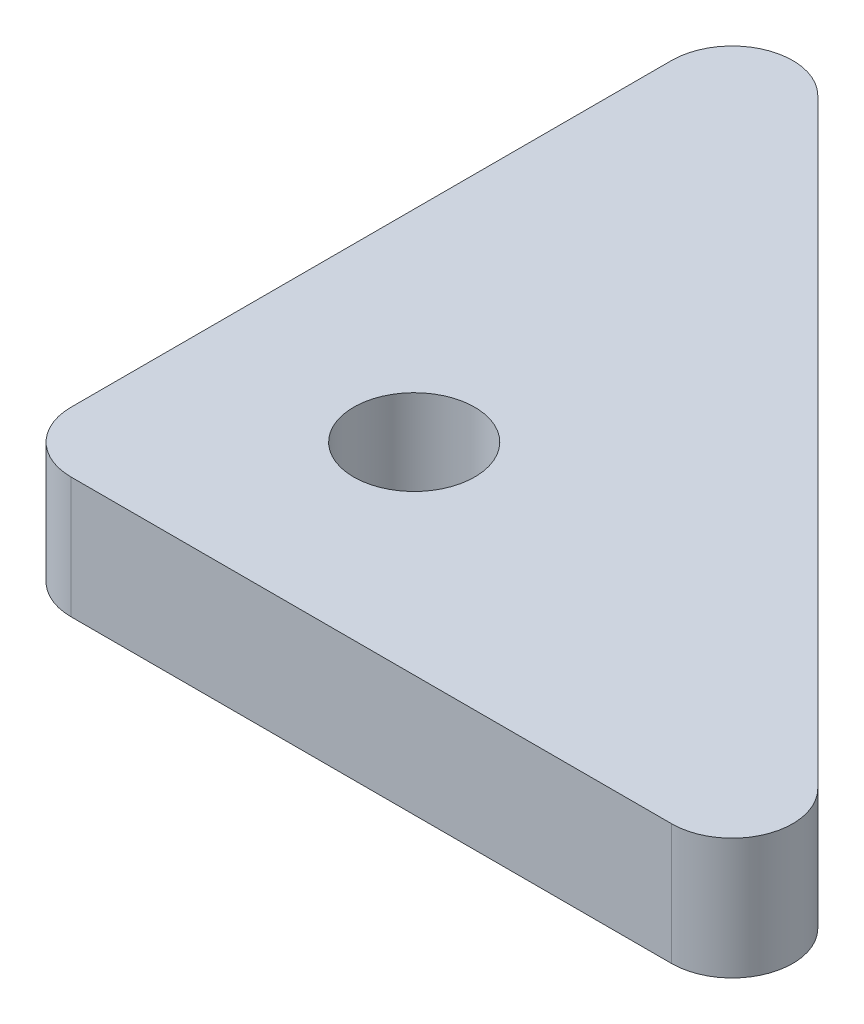
ISO-10303-21;
HEADER;
FILE_DESCRIPTION(('STEP AP214'),'2;1');
FILE_NAME('part.step','',(''),(''),'','','');
FILE_SCHEMA(('AUTOMOTIVE_DESIGN { 1 0 10303 214 1 1 1 1 }'));
ENDSEC;
DATA;
#1=APPLICATION_CONTEXT('core data for automotive mechanical design processes');
#2=APPLICATION_PROTOCOL_DEFINITION('international standard','automotive_design',2000,#1);
#3=PRODUCT_CONTEXT('',#1,'mechanical');
#4=PRODUCT('Part','Part','',(#3));
#5=PRODUCT_RELATED_PRODUCT_CATEGORY('part','',(#4));
#6=PRODUCT_DEFINITION_FORMATION('','',#4);
#7=PRODUCT_DEFINITION_CONTEXT('part definition',#1,'design');
#8=PRODUCT_DEFINITION('design','',#6,#7);
#9=PRODUCT_DEFINITION_SHAPE('','',#8);
#10=(LENGTH_UNIT() NAMED_UNIT(*) SI_UNIT(.MILLI.,.METRE.));
#11=(NAMED_UNIT(*) PLANE_ANGLE_UNIT() SI_UNIT($,.RADIAN.));
#12=(NAMED_UNIT(*) SI_UNIT($,.STERADIAN.) SOLID_ANGLE_UNIT());
#13=UNCERTAINTY_MEASURE_WITH_UNIT(LENGTH_MEASURE(1.E-05),#10,'distance_accuracy_value','');
#14=(GEOMETRIC_REPRESENTATION_CONTEXT(3) GLOBAL_UNCERTAINTY_ASSIGNED_CONTEXT((#13)) GLOBAL_UNIT_ASSIGNED_CONTEXT((#10,
#11,#12)) REPRESENTATION_CONTEXT('',''));
#15=CARTESIAN_POINT('',(0.,0.,0.));
#16=DIRECTION('',(0.,0.,1.));
#17=DIRECTION('',(1.,0.,0.));
#18=AXIS2_PLACEMENT_3D('',#15,#16,#17);
#19=CARTESIAN_POINT('',(3.,6.,-3.));
#20=DIRECTION('',(0.,-1.,0.));
#21=DIRECTION('',(0.,0.,-1.));
#22=AXIS2_PLACEMENT_3D('',#19,#20,#21);
#23=PLANE('',#22);
#24=CARTESIAN_POINT('',(3.,6.,-3.));
#25=DIRECTION('',(0.,1.,0.));
#26=DIRECTION('',(0.,0.,-1.));
#27=AXIS2_PLACEMENT_3D('',#24,#25,#26);
#28=CIRCLE('',#27,3.);
#29=CARTESIAN_POINT('',(0.,6.,-3.00000000000002));
#30=VERTEX_POINT('',#29);
#31=CARTESIAN_POINT('',(3.00000000000002,6.,0.));
#32=VERTEX_POINT('',#31);
#33=EDGE_CURVE('E131',#30,#32,#28,.T.);
#34=ORIENTED_EDGE('',*,*,#33,.T.);
#35=DIRECTION('',(1.,0.,0.));
#36=VECTOR('',#35,1.);
#37=CARTESIAN_POINT('',(3.00000000000002,6.,0.));
#38=LINE('',#37,#36);
#39=CARTESIAN_POINT('',(32.7573593128806,6.,0.));
#40=VERTEX_POINT('',#39);
#41=EDGE_CURVE('E89',#32,#40,#38,.T.);
#42=ORIENTED_EDGE('',*,*,#41,.T.);
#43=CARTESIAN_POINT('',(32.7573593128807,6.,-3.));
#44=DIRECTION('',(0.,1.,0.));
#45=DIRECTION('',(0.,0.,1.));
#46=AXIS2_PLACEMENT_3D('',#43,#44,#45);
#47=CIRCLE('',#46,3.);
#48=CARTESIAN_POINT('',(34.8786796564403,6.,-5.1213203435597));
#49=VERTEX_POINT('',#48);
#50=EDGE_CURVE('E102',#40,#49,#47,.T.);
#51=ORIENTED_EDGE('',*,*,#50,.T.);
#52=DIRECTION('',(-0.707106781186547,0.,-0.707106781186547));
#53=VECTOR('',#52,1.);
#54=CARTESIAN_POINT('',(5.12132034355969,6.,-34.8786796564403));
#55=LINE('',#54,#53);
#56=CARTESIAN_POINT('',(5.12132034355969,6.,-34.8786796564403));
#57=VERTEX_POINT('',#56);
#58=EDGE_CURVE('E96',#49,#57,#55,.T.);
#59=ORIENTED_EDGE('',*,*,#58,.T.);
#60=CARTESIAN_POINT('',(3.,6.,-32.7573593128807));
#61=DIRECTION('',(0.,1.,0.));
#62=DIRECTION('',(0.,0.,-1.));
#63=AXIS2_PLACEMENT_3D('',#60,#61,#62);
#64=CIRCLE('',#63,3.);
#65=CARTESIAN_POINT('',(0.,6.,-32.7573593128806));
#66=VERTEX_POINT('',#65);
#67=EDGE_CURVE('E100',#57,#66,#64,.T.);
#68=ORIENTED_EDGE('',*,*,#67,.T.);
#69=DIRECTION('',(0.,0.,1.));
#70=VECTOR('',#69,1.);
#71=CARTESIAN_POINT('',(0.,6.,-3.00000000000002));
#72=LINE('',#71,#70);
#73=EDGE_CURVE('E52',#66,#30,#72,.T.);
#74=ORIENTED_EDGE('',*,*,#73,.T.);
#75=EDGE_LOOP('',(#34,#42,#51,#59,#68,#74));
#76=FACE_BOUND('',#75,.T.);
#77=CARTESIAN_POINT('',(10.,6.,-10.));
#78=DIRECTION('',(0.,1.,0.));
#79=DIRECTION('',(0.,0.,1.));
#80=AXIS2_PLACEMENT_3D('',#77,#78,#79);
#81=CIRCLE('',#80,3.);
#82=CARTESIAN_POINT('',(10.,6.,-7.));
#83=VERTEX_POINT('',#82);
#84=EDGE_CURVE('E124',#83,#83,#81,.T.);
#85=ORIENTED_EDGE('',*,*,#84,.F.);
#86=EDGE_LOOP('',(#85));
#87=FACE_BOUND('',#86,.T.);
#88=ADVANCED_FACE('F35',(#76,#87),#23,.F.);
#89=CARTESIAN_POINT('',(3.,0.,-3.));
#90=DIRECTION('',(0.,-1.,0.));
#91=DIRECTION('',(0.,0.,-1.));
#92=AXIS2_PLACEMENT_3D('',#89,#90,#91);
#93=PLANE('',#92);
#94=CARTESIAN_POINT('',(3.,0.,-3.));
#95=DIRECTION('',(0.,1.,0.));
#96=DIRECTION('',(0.,0.,-1.));
#97=AXIS2_PLACEMENT_3D('',#94,#95,#96);
#98=CIRCLE('',#97,3.);
#99=CARTESIAN_POINT('',(0.,0.,-3.00000000000002));
#100=VERTEX_POINT('',#99);
#101=CARTESIAN_POINT('',(3.00000000000002,0.,0.));
#102=VERTEX_POINT('',#101);
#103=EDGE_CURVE('E120',#100,#102,#98,.T.);
#104=ORIENTED_EDGE('',*,*,#103,.F.);
#105=DIRECTION('',(0.,0.,1.));
#106=VECTOR('',#105,1.);
#107=CARTESIAN_POINT('',(0.,0.,-3.00000000000002));
#108=LINE('',#107,#106);
#109=CARTESIAN_POINT('',(0.,0.,-32.7573593128806));
#110=VERTEX_POINT('',#109);
#111=EDGE_CURVE('E81',#110,#100,#108,.T.);
#112=ORIENTED_EDGE('',*,*,#111,.F.);
#113=CARTESIAN_POINT('',(3.,0.,-32.7573593128807));
#114=DIRECTION('',(0.,1.,0.));
#115=DIRECTION('',(0.,0.,-1.));
#116=AXIS2_PLACEMENT_3D('',#113,#114,#115);
#117=CIRCLE('',#116,3.);
#118=CARTESIAN_POINT('',(5.12132034355969,0.,-34.8786796564403));
#119=VERTEX_POINT('',#118);
#120=EDGE_CURVE('E75',#119,#110,#117,.T.);
#121=ORIENTED_EDGE('',*,*,#120,.F.);
#122=DIRECTION('',(-0.707106781186547,0.,-0.707106781186547));
#123=VECTOR('',#122,1.);
#124=CARTESIAN_POINT('',(5.12132034355969,0.,-34.8786796564403));
#125=LINE('',#124,#123);
#126=CARTESIAN_POINT('',(34.8786796564403,0.,-5.1213203435597));
#127=VERTEX_POINT('',#126);
#128=EDGE_CURVE('E110',#127,#119,#125,.T.);
#129=ORIENTED_EDGE('',*,*,#128,.F.);
#130=CARTESIAN_POINT('',(32.7573593128807,0.,-3.));
#131=DIRECTION('',(0.,1.,0.));
#132=DIRECTION('',(0.,0.,1.));
#133=AXIS2_PLACEMENT_3D('',#130,#131,#132);
#134=CIRCLE('',#133,3.);
#135=CARTESIAN_POINT('',(32.7573593128806,0.,0.));
#136=VERTEX_POINT('',#135);
#137=EDGE_CURVE('E126',#136,#127,#134,.T.);
#138=ORIENTED_EDGE('',*,*,#137,.F.);
#139=DIRECTION('',(1.,0.,0.));
#140=VECTOR('',#139,1.);
#141=CARTESIAN_POINT('',(3.00000000000002,0.,0.));
#142=LINE('',#141,#140);
#143=EDGE_CURVE('E123',#102,#136,#142,.T.);
#144=ORIENTED_EDGE('',*,*,#143,.F.);
#145=EDGE_LOOP('',(#104,#112,#121,#129,#138,#144));
#146=FACE_BOUND('',#145,.T.);
#147=CARTESIAN_POINT('',(10.,0.,-10.));
#148=DIRECTION('',(0.,1.,0.));
#149=DIRECTION('',(0.,0.,1.));
#150=AXIS2_PLACEMENT_3D('',#147,#148,#149);
#151=CIRCLE('',#150,3.);
#152=CARTESIAN_POINT('',(10.,0.,-7.));
#153=VERTEX_POINT('',#152);
#154=EDGE_CURVE('E224',#153,#153,#151,.T.);
#155=ORIENTED_EDGE('',*,*,#154,.T.);
#156=EDGE_LOOP('',(#155));
#157=FACE_BOUND('',#156,.T.);
#158=ADVANCED_FACE('F140',(#146,#157),#93,.T.);
#159=CARTESIAN_POINT('',(3.,6.,-3.));
#160=DIRECTION('',(0.,-1.,0.));
#161=DIRECTION('',(0.,0.,-1.));
#162=AXIS2_PLACEMENT_3D('',#159,#160,#161);
#163=CYLINDRICAL_SURFACE('',#162,3.);
#164=ORIENTED_EDGE('',*,*,#103,.T.);
#165=DIRECTION('',(0.,-1.,0.));
#166=VECTOR('',#165,1.);
#167=CARTESIAN_POINT('',(3.00000000000002,6.,0.));
#168=LINE('',#167,#166);
#169=EDGE_CURVE('E11',#32,#102,#168,.T.);
#170=ORIENTED_EDGE('',*,*,#169,.F.);
#171=ORIENTED_EDGE('',*,*,#33,.F.);
#172=DIRECTION('',(0.,-1.,0.));
#173=VECTOR('',#172,1.);
#174=CARTESIAN_POINT('',(0.,6.,-3.00000000000002));
#175=LINE('',#174,#173);
#176=EDGE_CURVE('E116',#30,#100,#175,.T.);
#177=ORIENTED_EDGE('',*,*,#176,.T.);
#178=EDGE_LOOP('',(#164,#170,#171,#177));
#179=FACE_BOUND('',#178,.T.);
#180=ADVANCED_FACE('F37',(#179),#163,.T.);
#181=CARTESIAN_POINT('',(3.00000000000002,6.,0.));
#182=DIRECTION('',(0.,0.,-1.));
#183=DIRECTION('',(-1.,0.,0.));
#184=AXIS2_PLACEMENT_3D('',#181,#182,#183);
#185=PLANE('',#184);
#186=ORIENTED_EDGE('',*,*,#143,.T.);
#187=DIRECTION('',(0.,-1.,0.));
#188=VECTOR('',#187,1.);
#189=CARTESIAN_POINT('',(32.7573593128806,6.,0.));
#190=LINE('',#189,#188);
#191=EDGE_CURVE('E44',#40,#136,#190,.T.);
#192=ORIENTED_EDGE('',*,*,#191,.F.);
#193=ORIENTED_EDGE('',*,*,#41,.F.);
#194=ORIENTED_EDGE('',*,*,#169,.T.);
#195=EDGE_LOOP('',(#186,#192,#193,#194));
#196=FACE_BOUND('',#195,.T.);
#197=ADVANCED_FACE('F165',(#196),#185,.F.);
#198=CARTESIAN_POINT('',(32.7573593128807,6.,-3.));
#199=DIRECTION('',(0.,-1.,0.));
#200=DIRECTION('',(0.,0.,-1.));
#201=AXIS2_PLACEMENT_3D('',#198,#199,#200);
#202=CYLINDRICAL_SURFACE('',#201,3.);
#203=ORIENTED_EDGE('',*,*,#137,.T.);
#204=DIRECTION('',(0.,-1.,0.));
#205=VECTOR('',#204,1.);
#206=CARTESIAN_POINT('',(34.8786796564403,6.,-5.1213203435597));
#207=LINE('',#206,#205);
#208=EDGE_CURVE('E111',#49,#127,#207,.T.);
#209=ORIENTED_EDGE('',*,*,#208,.F.);
#210=ORIENTED_EDGE('',*,*,#50,.F.);
#211=ORIENTED_EDGE('',*,*,#191,.T.);
#212=EDGE_LOOP('',(#203,#209,#210,#211));
#213=FACE_BOUND('',#212,.T.);
#214=ADVANCED_FACE('F137',(#213),#202,.T.);
#215=CARTESIAN_POINT('',(5.12132034355969,6.,-34.8786796564403));
#216=DIRECTION('',(-0.707106781186548,0.,0.707106781186548));
#217=DIRECTION('',(0.707106781186548,0.,0.707106781186548));
#218=AXIS2_PLACEMENT_3D('',#215,#216,#217);
#219=PLANE('',#218);
#220=ORIENTED_EDGE('',*,*,#128,.T.);
#221=DIRECTION('',(0.,-1.,0.));
#222=VECTOR('',#221,1.);
#223=CARTESIAN_POINT('',(5.12132034355969,6.,-34.8786796564403));
#224=LINE('',#223,#222);
#225=EDGE_CURVE('E107',#57,#119,#224,.T.);
#226=ORIENTED_EDGE('',*,*,#225,.F.);
#227=ORIENTED_EDGE('',*,*,#58,.F.);
#228=ORIENTED_EDGE('',*,*,#208,.T.);
#229=EDGE_LOOP('',(#220,#226,#227,#228));
#230=FACE_BOUND('',#229,.T.);
#231=ADVANCED_FACE('F108',(#230),#219,.F.);
#232=CARTESIAN_POINT('',(3.,6.,-32.7573593128807));
#233=DIRECTION('',(0.,-1.,0.));
#234=DIRECTION('',(0.,0.,-1.));
#235=AXIS2_PLACEMENT_3D('',#232,#233,#234);
#236=CYLINDRICAL_SURFACE('',#235,3.);
#237=ORIENTED_EDGE('',*,*,#120,.T.);
#238=DIRECTION('',(0.,-1.,0.));
#239=VECTOR('',#238,1.);
#240=CARTESIAN_POINT('',(0.,6.,-32.7573593128806));
#241=LINE('',#240,#239);
#242=EDGE_CURVE('E112',#66,#110,#241,.T.);
#243=ORIENTED_EDGE('',*,*,#242,.F.);
#244=ORIENTED_EDGE('',*,*,#67,.F.);
#245=ORIENTED_EDGE('',*,*,#225,.T.);
#246=EDGE_LOOP('',(#237,#243,#244,#245));
#247=FACE_BOUND('',#246,.T.);
#248=ADVANCED_FACE('F114',(#247),#236,.T.);
#249=CARTESIAN_POINT('',(0.,6.,-3.00000000000002));
#250=DIRECTION('',(1.,0.,0.));
#251=DIRECTION('',(0.,0.,-1.));
#252=AXIS2_PLACEMENT_3D('',#249,#250,#251);
#253=PLANE('',#252);
#254=ORIENTED_EDGE('',*,*,#111,.T.);
#255=ORIENTED_EDGE('',*,*,#176,.F.);
#256=ORIENTED_EDGE('',*,*,#73,.F.);
#257=ORIENTED_EDGE('',*,*,#242,.T.);
#258=EDGE_LOOP('',(#254,#255,#256,#257));
#259=FACE_BOUND('',#258,.T.);
#260=ADVANCED_FACE('F145',(#259),#253,.F.);
#261=CARTESIAN_POINT('',(10.,6.,-10.));
#262=DIRECTION('',(0.,-1.,0.));
#263=DIRECTION('',(0.,0.,-1.));
#264=AXIS2_PLACEMENT_3D('',#261,#262,#263);
#265=CYLINDRICAL_SURFACE('',#264,3.);
#266=ORIENTED_EDGE('',*,*,#84,.T.);
#267=EDGE_LOOP('',(#266));
#268=FACE_BOUND('',#267,.T.);
#269=ORIENTED_EDGE('',*,*,#154,.F.);
#270=EDGE_LOOP('',(#269));
#271=FACE_BOUND('',#270,.T.);
#272=ADVANCED_FACE('F147',(#268,#271),#265,.F.);
#273=CLOSED_SHELL('',(#88,#158,#180,#197,#214,#231,#248,#260,#272));
#274=MANIFOLD_SOLID_BREP('B2',#273);
#275=ADVANCED_BREP_SHAPE_REPRESENTATION('',(#18,#274),#14);
#276=SHAPE_DEFINITION_REPRESENTATION(#9,#275);
ENDSEC;
END-ISO-10303-21;
